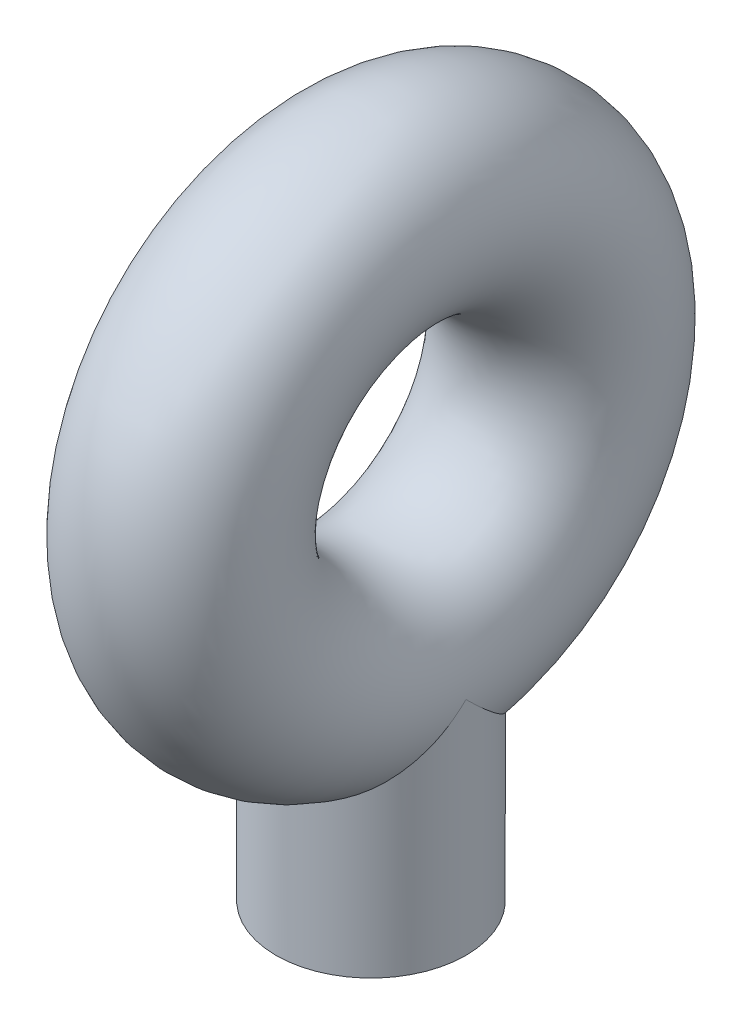
ISO-10303-21;
HEADER;
FILE_DESCRIPTION(('STEP AP214'),'2;1');
FILE_NAME('part.step','',(''),(''),'','','');
FILE_SCHEMA(('AUTOMOTIVE_DESIGN { 1 0 10303 214 1 1 1 1 }'));
ENDSEC;
DATA;
#1=APPLICATION_CONTEXT('core data for automotive mechanical design processes');
#2=APPLICATION_PROTOCOL_DEFINITION('international standard','automotive_design',2000,#1);
#3=PRODUCT_CONTEXT('',#1,'mechanical');
#4=PRODUCT('Part','Part','',(#3));
#5=PRODUCT_RELATED_PRODUCT_CATEGORY('part','',(#4));
#6=PRODUCT_DEFINITION_FORMATION('','',#4);
#7=PRODUCT_DEFINITION_CONTEXT('part definition',#1,'design');
#8=PRODUCT_DEFINITION('design','',#6,#7);
#9=PRODUCT_DEFINITION_SHAPE('','',#8);
#10=(LENGTH_UNIT() NAMED_UNIT(*) SI_UNIT(.MILLI.,.METRE.));
#11=(NAMED_UNIT(*) PLANE_ANGLE_UNIT() SI_UNIT($,.RADIAN.));
#12=(NAMED_UNIT(*) SI_UNIT($,.STERADIAN.) SOLID_ANGLE_UNIT());
#13=UNCERTAINTY_MEASURE_WITH_UNIT(LENGTH_MEASURE(1.E-05),#10,'distance_accuracy_value','');
#14=(GEOMETRIC_REPRESENTATION_CONTEXT(3) GLOBAL_UNCERTAINTY_ASSIGNED_CONTEXT((#13)) GLOBAL_UNIT_ASSIGNED_CONTEXT((#10,
#11,#12)) REPRESENTATION_CONTEXT('',''));
#15=CARTESIAN_POINT('',(0.,0.,0.));
#16=DIRECTION('',(0.,0.,1.));
#17=DIRECTION('',(1.,0.,0.));
#18=AXIS2_PLACEMENT_3D('',#15,#16,#17);
#19=CARTESIAN_POINT('',(0.,6.5,0.));
#20=DIRECTION('',(-1.,0.,0.));
#21=DIRECTION('',(0.,0.,1.));
#22=AXIS2_PLACEMENT_3D('',#19,#20,#21);
#23=TOROIDAL_SURFACE('',#22,3.,1.5);
#24=CARTESIAN_POINT('',(1.50000000000002,3.5,0.));
#25=CARTESIAN_POINT('',(1.50000000196108,3.49817430976753,0.00182568179399735));
#26=CARTESIAN_POINT('',(1.4999966687273,3.49634939833264,0.00365226014661502));
#27=CARTESIAN_POINT('',(1.49966257165521,3.40508766110898,0.0950809468478174));
#28=CARTESIAN_POINT('',(1.49129468643201,3.31753776870572,0.186809201785706));
#29=CARTESIAN_POINT('',(1.45622192401661,3.14760172676895,0.371890948515781));
#30=CARTESIAN_POINT('',(1.42948851364085,3.06522383024909,0.465246748632477));
#31=CARTESIAN_POINT('',(1.36166949420433,2.92060650686051,0.63462061581811));
#32=CARTESIAN_POINT('',(1.32369231504764,2.8572907930011,0.710950509112234));
#33=CARTESIAN_POINT('',(1.23249089930465,2.73704069375191,0.859376665790925));
#34=CARTESIAN_POINT('',(1.17929155793509,2.6800960984777,0.931479612053292));
#35=CARTESIAN_POINT('',(1.06821497609057,2.58384857017982,1.05572576603742));
#36=CARTESIAN_POINT('',(1.01290429071921,2.5432152478157,1.10912537104278));
#37=CARTESIAN_POINT('',(0.891982301560762,2.46857121682257,1.20850425272689));
#38=CARTESIAN_POINT('',(0.826372350641687,2.43455963970174,1.25448450237442));
#39=CARTESIAN_POINT('',(0.685284169963276,2.37424159165778,1.33682692638079));
#40=CARTESIAN_POINT('',(0.609731006546357,2.34799911279547,1.37310899442063));
#41=CARTESIAN_POINT('',(0.451259489855185,2.30494044167382,1.43300918008605));
#42=CARTESIAN_POINT('',(0.36834860601127,2.2881148135953,1.45663997343494));
#43=CARTESIAN_POINT('',(0.210301561704035,2.26651490459434,1.48704968953726));
#44=CARTESIAN_POINT('',(0.135713777330974,2.26037764786171,1.49573247674993));
#45=CARTESIAN_POINT('',(-0.0141349500377863,2.25608387598922,1.50180294398687));
#46=CARTESIAN_POINT('',(-0.0893955279547048,2.25792326707601,1.4991964179108));
#47=CARTESIAN_POINT('',(-0.232304870065483,2.26903217244049,1.48351053569736));
#48=CARTESIAN_POINT('',(-0.300092884725645,2.27771742581549,1.47125478359563));
#49=CARTESIAN_POINT('',(-0.432302981202663,2.30143268932871,1.43797128113197));
#50=CARTESIAN_POINT('',(-0.496724965374077,2.31646288341309,1.41694327645388));
#51=CARTESIAN_POINT('',(-0.62275628091278,2.3528938886355,1.36635808790249));
#52=CARTESIAN_POINT('',(-0.684208598058009,2.37448397911594,1.33654842653322));
#53=CARTESIAN_POINT('',(-0.800901705136182,2.42311436243448,1.27006765392525));
#54=CARTESIAN_POINT('',(-0.85614060260723,2.45015630881493,1.23339446122698));
#55=CARTESIAN_POINT('',(-0.965889642951022,2.51243252863937,1.14993610311956));
#56=CARTESIAN_POINT('',(-1.01954302440107,2.54825717746568,1.10246819136273));
#57=CARTESIAN_POINT('',(-1.11794256468099,2.62484231150683,1.00256277562415));
#58=CARTESIAN_POINT('',(-1.16268169203104,2.66560665266764,0.95012139636224));
#59=CARTESIAN_POINT('',(-1.26140394697742,2.77049069504104,0.817567132970817));
#60=CARTESIAN_POINT('',(-1.31051497503539,2.83687744866229,0.735603988855568));
#61=CARTESIAN_POINT('',(-1.39112163768258,2.97623021432676,0.568681132820712));
#62=CARTESIAN_POINT('',(-1.42259276068354,3.04920521852597,0.483717424748497));
#63=CARTESIAN_POINT('',(-1.46431993446898,3.18366269843607,0.332433556377724));
#64=CARTESIAN_POINT('',(-1.47770380548597,3.24418635903027,0.26608340791713));
#65=CARTESIAN_POINT('',(-1.49541411768762,3.36765741310498,0.134628255935893));
#66=CARTESIAN_POINT('',(-1.49975595990154,3.43060049904724,0.0695213226617512));
#67=CARTESIAN_POINT('',(-1.49999666898593,3.49634938422661,0.00365227751497492));
#68=CARTESIAN_POINT('',(-1.50000000228895,3.49817429567351,0.00182569920889854));
#69=CARTESIAN_POINT('',(-1.50000000000002,3.5,0.));
#70=B_SPLINE_CURVE_WITH_KNOTS('',3,(#24,#25,#26,#27,#28,#29,#30,#31,#32,#33,#34,#35,#36,#37,#38,
#39,#40,#41,#42,#43,#44,#45,#46,#47,#48,#49,#50,#51,#52,#53,#54,#55,#56,#57,#58,#59,#60,#61,#62,
#63,#64,#65,#66,#67,#68,#69),.UNSPECIFIED.,.F.,.F.,(4,2,2,2,2,2,2,2,2,2,2,2,2,2,2,2,2,2,2,2,2,2,
4),(0.,0.00774597396461016,0.387534067236502,0.767913548082651,1.08532536791516,
1.40222101222722,1.66206381070555,1.92187250584846,2.18376516495767,2.445394931885,
2.67019766753188,2.89488504362798,3.10223549873851,3.30959196555891,3.52361492555718,
3.73770289642223,3.97707846232095,4.21664210436279,4.56379462365786,4.91142834153564,
5.18334428025622,5.45479669225855,5.46254266622434),.UNSPECIFIED.);
#71=CARTESIAN_POINT('',(1.5,3.5,8.02730036121557E-13));
#72=VERTEX_POINT('',#71);
#73=CARTESIAN_POINT('',(-1.50000000000015,3.5,0.));
#74=VERTEX_POINT('',#73);
#75=EDGE_CURVE('E53',#72,#74,#70,.T.);
#76=ORIENTED_EDGE('',*,*,#75,.F.);
#77=CARTESIAN_POINT('',(-1.50000000000002,3.5,0.));
#78=CARTESIAN_POINT('',(-1.50000000196108,3.49817430976753,-0.00182568179399733));
#79=CARTESIAN_POINT('',(-1.4999966687273,3.49634939833264,-0.00365226014661497));
#80=CARTESIAN_POINT('',(-1.49966257165521,3.40508766110898,-0.0950809468478165));
#81=CARTESIAN_POINT('',(-1.49129468643201,3.31753776870572,-0.186809201785706));
#82=CARTESIAN_POINT('',(-1.45622192401661,3.14760172676895,-0.371890948515781));
#83=CARTESIAN_POINT('',(-1.42948851364085,3.06522383024909,-0.465246748632478));
#84=CARTESIAN_POINT('',(-1.36166949420433,2.92060650686051,-0.63462061581811));
#85=CARTESIAN_POINT('',(-1.32369231504764,2.8572907930011,-0.710950509112234));
#86=CARTESIAN_POINT('',(-1.23249089930465,2.73704069375191,-0.859376665790925));
#87=CARTESIAN_POINT('',(-1.17929155793509,2.6800960984777,-0.931479612053292));
#88=CARTESIAN_POINT('',(-1.06821497609057,2.58384857017982,-1.05572576603742));
#89=CARTESIAN_POINT('',(-1.01290429071921,2.5432152478157,-1.10912537104278));
#90=CARTESIAN_POINT('',(-0.891982301560762,2.46857121682257,-1.20850425272689));
#91=CARTESIAN_POINT('',(-0.826372350641687,2.43455963970174,-1.25448450237442));
#92=CARTESIAN_POINT('',(-0.685284169963276,2.37424159165778,-1.33682692638079));
#93=CARTESIAN_POINT('',(-0.609731006546357,2.34799911279547,-1.37310899442063));
#94=CARTESIAN_POINT('',(-0.451259489855186,2.30494044167383,-1.43300918008605));
#95=CARTESIAN_POINT('',(-0.36834860601127,2.2881148135953,-1.45663997343494));
#96=CARTESIAN_POINT('',(-0.210301561704035,2.26651490459434,-1.48704968953726));
#97=CARTESIAN_POINT('',(-0.135713777330974,2.26037764786171,-1.49573247674993));
#98=CARTESIAN_POINT('',(0.0141349500377863,2.25608387598922,-1.50180294398687));
#99=CARTESIAN_POINT('',(0.0893955279547048,2.25792326707601,-1.4991964179108));
#100=CARTESIAN_POINT('',(0.232304870065483,2.26903217244049,-1.48351053569736));
#101=CARTESIAN_POINT('',(0.300092884725645,2.27771742581549,-1.47125478359563));
#102=CARTESIAN_POINT('',(0.432302981202663,2.30143268932871,-1.43797128113197));
#103=CARTESIAN_POINT('',(0.496724965374077,2.31646288341309,-1.41694327645388));
#104=CARTESIAN_POINT('',(0.62275628091278,2.3528938886355,-1.36635808790249));
#105=CARTESIAN_POINT('',(0.684208598058009,2.37448397911594,-1.33654842653322));
#106=CARTESIAN_POINT('',(0.800901705136182,2.42311436243448,-1.27006765392525));
#107=CARTESIAN_POINT('',(0.85614060260723,2.45015630881493,-1.23339446122698));
#108=CARTESIAN_POINT('',(0.965889642951022,2.51243252863937,-1.14993610311956));
#109=CARTESIAN_POINT('',(1.01954302440107,2.54825717746568,-1.10246819136273));
#110=CARTESIAN_POINT('',(1.11794256468099,2.62484231150683,-1.00256277562415));
#111=CARTESIAN_POINT('',(1.16268169203104,2.66560665266764,-0.95012139636224));
#112=CARTESIAN_POINT('',(1.26140394697742,2.77049069504104,-0.817567132970817));
#113=CARTESIAN_POINT('',(1.31051497503539,2.83687744866229,-0.735603988855568));
#114=CARTESIAN_POINT('',(1.39112163768258,2.97623021432676,-0.568681132820712));
#115=CARTESIAN_POINT('',(1.42259276068354,3.04920521852597,-0.483717424748497));
#116=CARTESIAN_POINT('',(1.46431993446898,3.18366269843607,-0.332433556377724));
#117=CARTESIAN_POINT('',(1.47770380548597,3.24418635903027,-0.26608340791713));
#118=CARTESIAN_POINT('',(1.49541411768762,3.36765741310498,-0.134628255935893));
#119=CARTESIAN_POINT('',(1.49975595990154,3.43060049904724,-0.0695213226617512));
#120=CARTESIAN_POINT('',(1.49999666898593,3.49634938422661,-0.00365227751497492));
#121=CARTESIAN_POINT('',(1.50000000228895,3.49817429567351,-0.00182569920889854));
#122=CARTESIAN_POINT('',(1.50000000000002,3.5,0.));
#123=B_SPLINE_CURVE_WITH_KNOTS('',3,(#77,#78,#79,#80,#81,#82,#83,#84,#85,#86,#87,#88,#89,#90,
#91,#92,#93,#94,#95,#96,#97,#98,#99,#100,#101,#102,#103,#104,#105,#106,#107,#108,#109,#110,#111,
#112,#113,#114,#115,#116,#117,#118,#119,#120,#121,#122),.UNSPECIFIED.,.F.,.F.,(4,2,2,2,2,2,2,2,
2,2,2,2,2,2,2,2,2,2,2,2,2,2,4),(0.,0.0077459739646101,0.387534067236502,0.767913548082651,
1.08532536791516,1.40222101222722,1.66206381070555,1.92187250584846,2.18376516495767,
2.445394931885,2.67019766753188,2.89488504362798,3.10223549873851,3.30959196555891,
3.52361492555718,3.73770289642223,3.97707846232095,4.21664210436279,4.56379462365786,
4.91142834153564,5.18334428025622,5.45479669225855,5.46254266622434),.UNSPECIFIED.);
#124=EDGE_CURVE('E60',#74,#72,#123,.T.);
#125=ORIENTED_EDGE('',*,*,#124,.F.);
#126=EDGE_LOOP('',(#76,#125));
#127=FACE_BOUND('',#126,.T.);
#128=ADVANCED_FACE('F43',(#127),#23,.T.);
#129=CARTESIAN_POINT('',(0.,3.5,0.));
#130=DIRECTION('',(0.,-1.,0.));
#131=DIRECTION('',(0.,0.,-1.));
#132=AXIS2_PLACEMENT_3D('',#129,#130,#131);
#133=CYLINDRICAL_SURFACE('',#132,1.5);
#134=ORIENTED_EDGE('',*,*,#124,.T.);
#135=ORIENTED_EDGE('',*,*,#75,.T.);
#136=EDGE_LOOP('',(#134,#135));
#137=FACE_BOUND('',#136,.T.);
#138=CARTESIAN_POINT('',(0.,0.,0.));
#139=DIRECTION('',(0.,1.,0.));
#140=DIRECTION('',(0.,0.,1.));
#141=AXIS2_PLACEMENT_3D('',#138,#139,#140);
#142=CIRCLE('',#141,1.5);
#143=CARTESIAN_POINT('',(0.,0.,1.5));
#144=VERTEX_POINT('',#143);
#145=EDGE_CURVE('E11',#144,#144,#142,.T.);
#146=ORIENTED_EDGE('',*,*,#145,.T.);
#147=EDGE_LOOP('',(#146));
#148=FACE_BOUND('',#147,.T.);
#149=ADVANCED_FACE('F45',(#137,#148),#133,.T.);
#150=CARTESIAN_POINT('',(0.,0.,0.));
#151=DIRECTION('',(0.,1.,0.));
#152=DIRECTION('',(0.,0.,1.));
#153=AXIS2_PLACEMENT_3D('',#150,#151,#152);
#154=PLANE('',#153);
#155=ORIENTED_EDGE('',*,*,#145,.F.);
#156=EDGE_LOOP('',(#155));
#157=FACE_BOUND('',#156,.T.);
#158=ADVANCED_FACE('F78',(#157),#154,.F.);
#159=CLOSED_SHELL('',(#128,#149,#158));
#160=MANIFOLD_SOLID_BREP('B2',#159);
#161=ADVANCED_BREP_SHAPE_REPRESENTATION('',(#18,#160),#14);
#162=SHAPE_DEFINITION_REPRESENTATION(#9,#161);
ENDSEC;
END-ISO-10303-21;
